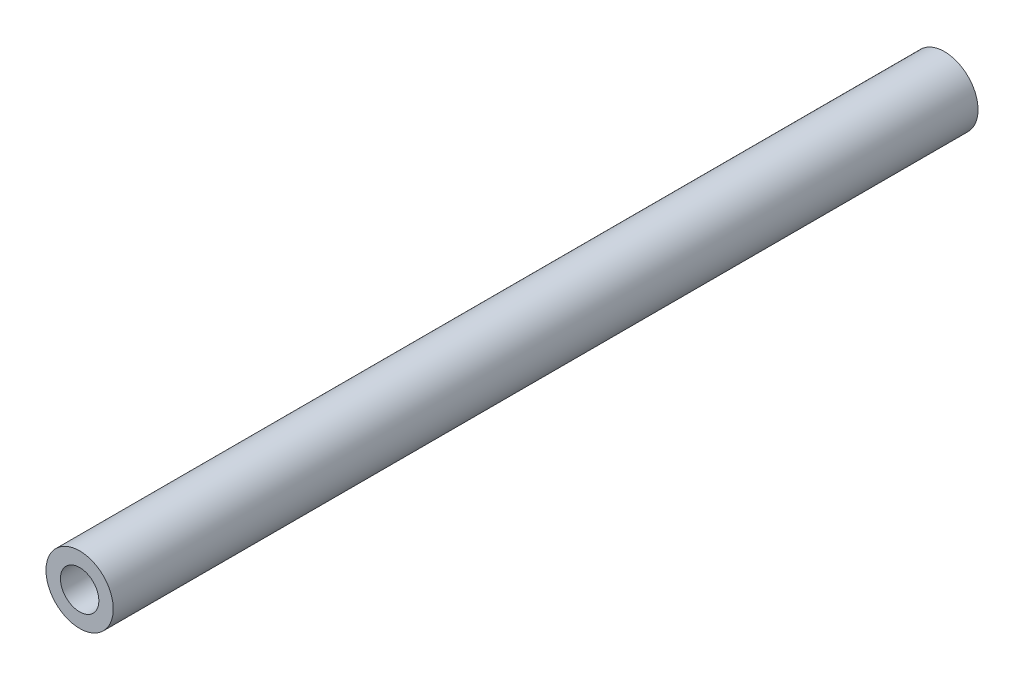
ISO-10303-21;
HEADER;
FILE_DESCRIPTION(('STEP AP214'),'2;1');
FILE_NAME('part.step','',(''),(''),'','','');
FILE_SCHEMA(('AUTOMOTIVE_DESIGN { 1 0 10303 214 1 1 1 1 }'));
ENDSEC;
DATA;
#1=APPLICATION_CONTEXT('core data for automotive mechanical design processes');
#2=APPLICATION_PROTOCOL_DEFINITION('international standard','automotive_design',2000,#1);
#3=PRODUCT_CONTEXT('',#1,'mechanical');
#4=PRODUCT('Part','Part','',(#3));
#5=PRODUCT_RELATED_PRODUCT_CATEGORY('part','',(#4));
#6=PRODUCT_DEFINITION_FORMATION('','',#4);
#7=PRODUCT_DEFINITION_CONTEXT('part definition',#1,'design');
#8=PRODUCT_DEFINITION('design','',#6,#7);
#9=PRODUCT_DEFINITION_SHAPE('','',#8);
#10=(LENGTH_UNIT() NAMED_UNIT(*) SI_UNIT(.MILLI.,.METRE.));
#11=(NAMED_UNIT(*) PLANE_ANGLE_UNIT() SI_UNIT($,.RADIAN.));
#12=(NAMED_UNIT(*) SI_UNIT($,.STERADIAN.) SOLID_ANGLE_UNIT());
#13=UNCERTAINTY_MEASURE_WITH_UNIT(LENGTH_MEASURE(1.E-05),#10,'distance_accuracy_value','');
#14=(GEOMETRIC_REPRESENTATION_CONTEXT(3) GLOBAL_UNCERTAINTY_ASSIGNED_CONTEXT((#13)) GLOBAL_UNIT_ASSIGNED_CONTEXT((#10,
#11,#12)) REPRESENTATION_CONTEXT('',''));
#15=CARTESIAN_POINT('',(0.,0.,0.));
#16=DIRECTION('',(0.,0.,1.));
#17=DIRECTION('',(1.,0.,0.));
#18=AXIS2_PLACEMENT_3D('',#15,#16,#17);
#19=CARTESIAN_POINT('',(0.,0.,22.5));
#20=DIRECTION('',(0.,0.,1.));
#21=DIRECTION('',(1.,0.,0.));
#22=AXIS2_PLACEMENT_3D('',#19,#20,#21);
#23=PLANE('',#22);
#24=CARTESIAN_POINT('',(0.,0.,22.5));
#25=DIRECTION('',(0.,0.,1.));
#26=DIRECTION('',(1.,0.,0.));
#27=AXIS2_PLACEMENT_3D('',#24,#25,#26);
#28=CIRCLE('',#27,1.75);
#29=CARTESIAN_POINT('',(-1.75,0.,22.5));
#30=VERTEX_POINT('',#29);
#31=EDGE_CURVE('E10',#30,#30,#28,.T.);
#32=ORIENTED_EDGE('',*,*,#31,.T.);
#33=EDGE_LOOP('',(#32));
#34=FACE_BOUND('',#33,.T.);
#35=CARTESIAN_POINT('',(0.,0.,22.5));
#36=DIRECTION('',(0.,0.,1.));
#37=DIRECTION('',(1.,0.,0.));
#38=AXIS2_PLACEMENT_3D('',#35,#36,#37);
#39=CIRCLE('',#38,1.);
#40=CARTESIAN_POINT('',(-1.,0.,22.5));
#41=VERTEX_POINT('',#40);
#42=EDGE_CURVE('E44',#41,#41,#39,.T.);
#43=ORIENTED_EDGE('',*,*,#42,.F.);
#44=EDGE_LOOP('',(#43));
#45=FACE_BOUND('',#44,.T.);
#46=ADVANCED_FACE('F33',(#34,#45),#23,.T.);
#47=CARTESIAN_POINT('',(0.,0.,-22.5));
#48=DIRECTION('',(0.,0.,1.));
#49=DIRECTION('',(1.,0.,0.));
#50=AXIS2_PLACEMENT_3D('',#47,#48,#49);
#51=PLANE('',#50);
#52=CARTESIAN_POINT('',(0.,0.,-22.5));
#53=DIRECTION('',(0.,0.,1.));
#54=DIRECTION('',(1.,0.,0.));
#55=AXIS2_PLACEMENT_3D('',#52,#53,#54);
#56=CIRCLE('',#55,1.75);
#57=CARTESIAN_POINT('',(-1.75,0.,-22.5));
#58=VERTEX_POINT('',#57);
#59=EDGE_CURVE('E37',#58,#58,#56,.T.);
#60=ORIENTED_EDGE('',*,*,#59,.F.);
#61=EDGE_LOOP('',(#60));
#62=FACE_BOUND('',#61,.T.);
#63=CARTESIAN_POINT('',(0.,0.,-22.5));
#64=DIRECTION('',(0.,0.,1.));
#65=DIRECTION('',(1.,0.,0.));
#66=AXIS2_PLACEMENT_3D('',#63,#64,#65);
#67=CIRCLE('',#66,1.);
#68=CARTESIAN_POINT('',(-1.,0.,-22.5));
#69=VERTEX_POINT('',#68);
#70=EDGE_CURVE('E46',#69,#69,#67,.T.);
#71=ORIENTED_EDGE('',*,*,#70,.T.);
#72=EDGE_LOOP('',(#71));
#73=FACE_BOUND('',#72,.T.);
#74=ADVANCED_FACE('F56',(#62,#73),#51,.F.);
#75=CARTESIAN_POINT('',(0.,0.,22.5));
#76=DIRECTION('',(0.,0.,-1.));
#77=DIRECTION('',(-1.,0.,0.));
#78=AXIS2_PLACEMENT_3D('',#75,#76,#77);
#79=CYLINDRICAL_SURFACE('',#78,1.75);
#80=CARTESIAN_POINT('',(-1.75,0.,22.5));
#81=CARTESIAN_POINT('',(-1.75,0.,22.03125));
#82=CARTESIAN_POINT('',(-1.75,0.,21.5625));
#83=CARTESIAN_POINT('',(-1.75,0.,20.625));
#84=CARTESIAN_POINT('',(-1.75,0.,20.15625));
#85=CARTESIAN_POINT('',(-1.75,0.,19.21875));
#86=CARTESIAN_POINT('',(-1.75,0.,18.75));
#87=CARTESIAN_POINT('',(-1.75,0.,17.8125));
#88=CARTESIAN_POINT('',(-1.75,0.,17.34375));
#89=CARTESIAN_POINT('',(-1.75,0.,16.40625));
#90=CARTESIAN_POINT('',(-1.75,0.,15.9375));
#91=CARTESIAN_POINT('',(-1.75,0.,15.));
#92=CARTESIAN_POINT('',(-1.75,0.,14.53125));
#93=CARTESIAN_POINT('',(-1.75,0.,13.59375));
#94=CARTESIAN_POINT('',(-1.75,0.,13.125));
#95=CARTESIAN_POINT('',(-1.75,0.,12.1875));
#96=CARTESIAN_POINT('',(-1.75,0.,11.71875));
#97=CARTESIAN_POINT('',(-1.75,0.,10.78125));
#98=CARTESIAN_POINT('',(-1.75,0.,10.3125));
#99=CARTESIAN_POINT('',(-1.75,0.,9.37499999999999));
#100=CARTESIAN_POINT('',(-1.75,0.,8.90625));
#101=CARTESIAN_POINT('',(-1.75,0.,7.96874999999999));
#102=CARTESIAN_POINT('',(-1.75,0.,7.5));
#103=CARTESIAN_POINT('',(-1.75,0.,6.5625));
#104=CARTESIAN_POINT('',(-1.75,0.,6.09375));
#105=CARTESIAN_POINT('',(-1.75,0.,5.15625));
#106=CARTESIAN_POINT('',(-1.75,0.,4.6875));
#107=CARTESIAN_POINT('',(-1.75,0.,3.75));
#108=CARTESIAN_POINT('',(-1.75,0.,3.28125));
#109=CARTESIAN_POINT('',(-1.75,0.,2.34375));
#110=CARTESIAN_POINT('',(-1.75,0.,1.875));
#111=CARTESIAN_POINT('',(-1.75,0.,0.937499999999997));
#112=CARTESIAN_POINT('',(-1.75,0.,0.468749999999997));
#113=CARTESIAN_POINT('',(-1.75,0.,-0.468750000000004));
#114=CARTESIAN_POINT('',(-1.75,0.,-0.937500000000004));
#115=CARTESIAN_POINT('',(-1.75,0.,-1.87500000000001));
#116=CARTESIAN_POINT('',(-1.75,0.,-2.34375000000001));
#117=CARTESIAN_POINT('',(-1.75,0.,-3.28125));
#118=CARTESIAN_POINT('',(-1.75,0.,-3.75));
#119=CARTESIAN_POINT('',(-1.75,0.,-4.6875));
#120=CARTESIAN_POINT('',(-1.75,0.,-5.15625));
#121=CARTESIAN_POINT('',(-1.75,0.,-6.09375000000001));
#122=CARTESIAN_POINT('',(-1.75,0.,-6.56250000000001));
#123=CARTESIAN_POINT('',(-1.75,0.,-7.50000000000001));
#124=CARTESIAN_POINT('',(-1.75,0.,-7.96875000000001));
#125=CARTESIAN_POINT('',(-1.75,0.,-8.90625));
#126=CARTESIAN_POINT('',(-1.75,0.,-9.37500000000001));
#127=CARTESIAN_POINT('',(-1.75,0.,-10.3125));
#128=CARTESIAN_POINT('',(-1.75,0.,-10.78125));
#129=CARTESIAN_POINT('',(-1.75,0.,-11.71875));
#130=CARTESIAN_POINT('',(-1.75,0.,-12.1875));
#131=CARTESIAN_POINT('',(-1.75,0.,-13.125));
#132=CARTESIAN_POINT('',(-1.75,0.,-13.59375));
#133=CARTESIAN_POINT('',(-1.75,0.,-14.53125));
#134=CARTESIAN_POINT('',(-1.75,0.,-15.));
#135=CARTESIAN_POINT('',(-1.75,0.,-15.9375));
#136=CARTESIAN_POINT('',(-1.75,0.,-16.40625));
#137=CARTESIAN_POINT('',(-1.75,0.,-17.34375));
#138=CARTESIAN_POINT('',(-1.75,0.,-17.8125));
#139=CARTESIAN_POINT('',(-1.75,0.,-18.75));
#140=CARTESIAN_POINT('',(-1.75,0.,-19.21875));
#141=CARTESIAN_POINT('',(-1.75,0.,-20.15625));
#142=CARTESIAN_POINT('',(-1.75,0.,-20.625));
#143=CARTESIAN_POINT('',(-1.75,0.,-21.5625));
#144=CARTESIAN_POINT('',(-1.75,0.,-22.03125));
#145=CARTESIAN_POINT('',(-1.75,0.,-22.5));
#146=B_SPLINE_CURVE_WITH_KNOTS('',3,(#80,#81,#82,#83,#84,#85,#86,#87,#88,#89,#90,#91,#92,#93,
#94,#95,#96,#97,#98,#99,#100,#101,#102,#103,#104,#105,#106,#107,#108,#109,#110,#111,#112,#113,
#114,#115,#116,#117,#118,#119,#120,#121,#122,#123,#124,#125,#126,#127,#128,#129,#130,#131,#132,
#133,#134,#135,#136,#137,#138,#139,#140,#141,#142,#143,#144,#145),.UNSPECIFIED.,.F.,.F.,(4,2,2,
2,2,2,2,2,2,2,2,2,2,2,2,2,2,2,2,2,2,2,2,2,2,2,2,2,2,2,2,2,4),(0.,1.40625,2.8125,4.21875,5.625,
7.03125,8.4375,9.84375,11.25,12.65625,14.0625,15.46875,16.875,18.28125,19.6875,21.09375,22.5,
23.90625,25.3125,26.71875,28.125,29.53125,30.9375,32.34375,33.75,35.15625,36.5625,37.96875,
39.375,40.78125,42.1875,43.59375,45.),.UNSPECIFIED.);
#147=EDGE_CURVE('BSEAM35',#30,#58,#146,.T.);
#148=ORIENTED_EDGE('',*,*,#31,.F.);
#149=ORIENTED_EDGE('',*,*,#59,.T.);
#150=ORIENTED_EDGE('',*,*,#147,.T.);
#151=ORIENTED_EDGE('',*,*,#147,.F.);
#152=EDGE_LOOP('',(#148,#150,#149,#151));
#153=FACE_BOUND('',#152,.T.);
#154=ADVANCED_FACE('F35',(#153),#79,.T.);
#155=CARTESIAN_POINT('',(0.,0.,22.5));
#156=DIRECTION('',(0.,0.,-1.));
#157=DIRECTION('',(-1.,0.,0.));
#158=AXIS2_PLACEMENT_3D('',#155,#156,#157);
#159=CYLINDRICAL_SURFACE('',#158,1.);
#160=CARTESIAN_POINT('',(-1.,0.,22.5));
#161=CARTESIAN_POINT('',(-1.,0.,22.03125));
#162=CARTESIAN_POINT('',(-1.,0.,21.5625));
#163=CARTESIAN_POINT('',(-1.,0.,20.625));
#164=CARTESIAN_POINT('',(-1.,0.,20.15625));
#165=CARTESIAN_POINT('',(-1.,0.,19.21875));
#166=CARTESIAN_POINT('',(-1.,0.,18.75));
#167=CARTESIAN_POINT('',(-1.,0.,17.8125));
#168=CARTESIAN_POINT('',(-1.,0.,17.34375));
#169=CARTESIAN_POINT('',(-1.,0.,16.40625));
#170=CARTESIAN_POINT('',(-1.,0.,15.9375));
#171=CARTESIAN_POINT('',(-1.,0.,15.));
#172=CARTESIAN_POINT('',(-1.,0.,14.53125));
#173=CARTESIAN_POINT('',(-1.,0.,13.59375));
#174=CARTESIAN_POINT('',(-1.,0.,13.125));
#175=CARTESIAN_POINT('',(-1.,0.,12.1875));
#176=CARTESIAN_POINT('',(-1.,0.,11.71875));
#177=CARTESIAN_POINT('',(-1.,0.,10.78125));
#178=CARTESIAN_POINT('',(-1.,0.,10.3125));
#179=CARTESIAN_POINT('',(-1.,0.,9.37499999999999));
#180=CARTESIAN_POINT('',(-1.,0.,8.90625));
#181=CARTESIAN_POINT('',(-1.,0.,7.96874999999999));
#182=CARTESIAN_POINT('',(-1.,0.,7.5));
#183=CARTESIAN_POINT('',(-1.,0.,6.5625));
#184=CARTESIAN_POINT('',(-1.,0.,6.09374999999999));
#185=CARTESIAN_POINT('',(-1.,0.,5.15624999999999));
#186=CARTESIAN_POINT('',(-1.,0.,4.68749999999999));
#187=CARTESIAN_POINT('',(-1.,0.,3.74999999999999));
#188=CARTESIAN_POINT('',(-1.,0.,3.28124999999999));
#189=CARTESIAN_POINT('',(-1.,0.,2.34375));
#190=CARTESIAN_POINT('',(-1.,0.,1.87499999999999));
#191=CARTESIAN_POINT('',(-1.,0.,0.937499999999994));
#192=CARTESIAN_POINT('',(-1.,0.,0.468749999999993));
#193=CARTESIAN_POINT('',(-1.,0.,-0.468750000000007));
#194=CARTESIAN_POINT('',(-1.,0.,-0.937500000000008));
#195=CARTESIAN_POINT('',(-1.,0.,-1.87500000000001));
#196=CARTESIAN_POINT('',(-1.,0.,-2.34375000000001));
#197=CARTESIAN_POINT('',(-1.,0.,-3.28125000000001));
#198=CARTESIAN_POINT('',(-1.,0.,-3.75000000000001));
#199=CARTESIAN_POINT('',(-1.,0.,-4.68750000000001));
#200=CARTESIAN_POINT('',(-1.,0.,-5.15625000000001));
#201=CARTESIAN_POINT('',(-1.,0.,-6.09375000000001));
#202=CARTESIAN_POINT('',(-1.,0.,-6.56250000000001));
#203=CARTESIAN_POINT('',(-1.,0.,-7.50000000000001));
#204=CARTESIAN_POINT('',(-1.,0.,-7.96875000000001));
#205=CARTESIAN_POINT('',(-1.,0.,-8.90625000000001));
#206=CARTESIAN_POINT('',(-1.,0.,-9.37500000000001));
#207=CARTESIAN_POINT('',(-1.,0.,-10.3125));
#208=CARTESIAN_POINT('',(-1.,0.,-10.78125));
#209=CARTESIAN_POINT('',(-1.,0.,-11.71875));
#210=CARTESIAN_POINT('',(-1.,0.,-12.1875));
#211=CARTESIAN_POINT('',(-1.,0.,-13.125));
#212=CARTESIAN_POINT('',(-1.,0.,-13.59375));
#213=CARTESIAN_POINT('',(-1.,0.,-14.53125));
#214=CARTESIAN_POINT('',(-1.,0.,-15.));
#215=CARTESIAN_POINT('',(-1.,0.,-15.9375));
#216=CARTESIAN_POINT('',(-1.,0.,-16.40625));
#217=CARTESIAN_POINT('',(-1.,0.,-17.34375));
#218=CARTESIAN_POINT('',(-1.,0.,-17.8125));
#219=CARTESIAN_POINT('',(-1.,0.,-18.75));
#220=CARTESIAN_POINT('',(-1.,0.,-19.21875));
#221=CARTESIAN_POINT('',(-1.,0.,-20.15625));
#222=CARTESIAN_POINT('',(-1.,0.,-20.625));
#223=CARTESIAN_POINT('',(-1.,0.,-21.5625));
#224=CARTESIAN_POINT('',(-1.,0.,-22.03125));
#225=CARTESIAN_POINT('',(-1.,0.,-22.5));
#226=B_SPLINE_CURVE_WITH_KNOTS('',3,(#160,#161,#162,#163,#164,#165,#166,#167,#168,#169,#170,
#171,#172,#173,#174,#175,#176,#177,#178,#179,#180,#181,#182,#183,#184,#185,#186,#187,#188,#189,
#190,#191,#192,#193,#194,#195,#196,#197,#198,#199,#200,#201,#202,#203,#204,#205,#206,#207,#208,
#209,#210,#211,#212,#213,#214,#215,#216,#217,#218,#219,#220,#221,#222,#223,#224,#225),
.UNSPECIFIED.,.F.,.F.,(4,2,2,2,2,2,2,2,2,2,2,2,2,2,2,2,2,2,2,2,2,2,2,2,2,2,2,2,2,2,2,2,4),(0.,
1.40625,2.8125,4.21875,5.625,7.03125,8.4375,9.84375,11.25,12.65625,14.0625,15.46875,16.875,
18.28125,19.6875,21.09375,22.5,23.90625,25.3125,26.71875,28.125,29.53125,30.9375,32.34375,33.75,
35.15625,36.5625,37.96875,39.375,40.78125,42.1875,43.59375,45.),.UNSPECIFIED.);
#227=EDGE_CURVE('BSEAM52',#41,#69,#226,.T.);
#228=ORIENTED_EDGE('',*,*,#42,.T.);
#229=ORIENTED_EDGE('',*,*,#70,.F.);
#230=ORIENTED_EDGE('',*,*,#227,.T.);
#231=ORIENTED_EDGE('',*,*,#227,.F.);
#232=EDGE_LOOP('',(#228,#230,#229,#231));
#233=FACE_BOUND('',#232,.T.);
#234=ADVANCED_FACE('F52',(#233),#159,.F.);
#235=CLOSED_SHELL('',(#46,#74,#154,#234));
#236=MANIFOLD_SOLID_BREP('B2',#235);
#237=ADVANCED_BREP_SHAPE_REPRESENTATION('',(#18,#236),#14);
#238=SHAPE_DEFINITION_REPRESENTATION(#9,#237);
ENDSEC;
END-ISO-10303-21;
